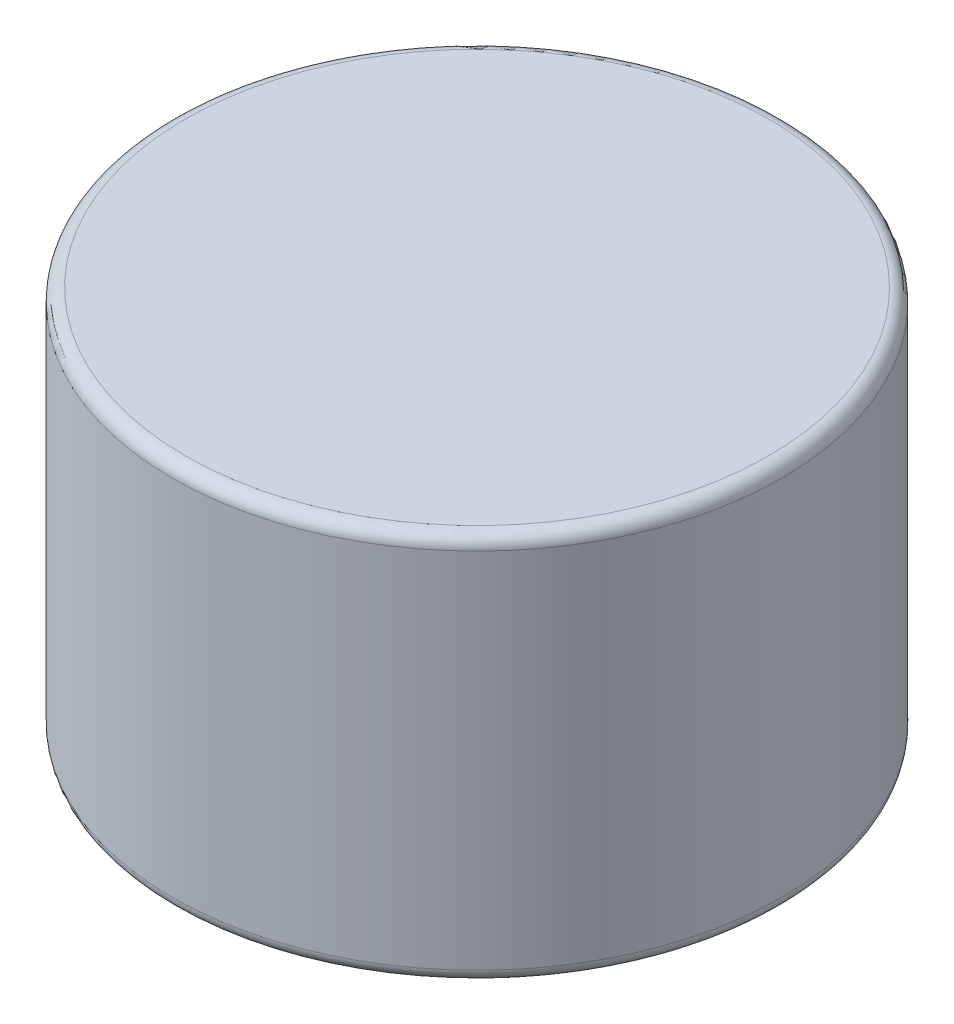
ISO-10303-21;
HEADER;
FILE_DESCRIPTION(('STEP AP214'),'2;1');
FILE_NAME('part.step','',(''),(''),'','','');
FILE_SCHEMA(('AUTOMOTIVE_DESIGN { 1 0 10303 214 1 1 1 1 }'));
ENDSEC;
DATA;
#1=APPLICATION_CONTEXT('core data for automotive mechanical design processes');
#2=APPLICATION_PROTOCOL_DEFINITION('international standard','automotive_design',2000,#1);
#3=PRODUCT_CONTEXT('',#1,'mechanical');
#4=PRODUCT('Part','Part','',(#3));
#5=PRODUCT_RELATED_PRODUCT_CATEGORY('part','',(#4));
#6=PRODUCT_DEFINITION_FORMATION('','',#4);
#7=PRODUCT_DEFINITION_CONTEXT('part definition',#1,'design');
#8=PRODUCT_DEFINITION('design','',#6,#7);
#9=PRODUCT_DEFINITION_SHAPE('','',#8);
#10=(LENGTH_UNIT() NAMED_UNIT(*) SI_UNIT(.MILLI.,.METRE.));
#11=(NAMED_UNIT(*) PLANE_ANGLE_UNIT() SI_UNIT($,.RADIAN.));
#12=(NAMED_UNIT(*) SI_UNIT($,.STERADIAN.) SOLID_ANGLE_UNIT());
#13=UNCERTAINTY_MEASURE_WITH_UNIT(LENGTH_MEASURE(1.E-05),#10,'distance_accuracy_value','');
#14=(GEOMETRIC_REPRESENTATION_CONTEXT(3) GLOBAL_UNCERTAINTY_ASSIGNED_CONTEXT((#13)) GLOBAL_UNIT_ASSIGNED_CONTEXT((#10,
#11,#12)) REPRESENTATION_CONTEXT('',''));
#15=CARTESIAN_POINT('',(0.,0.,0.));
#16=DIRECTION('',(0.,0.,1.));
#17=DIRECTION('',(1.,0.,0.));
#18=AXIS2_PLACEMENT_3D('',#15,#16,#17);
#19=CARTESIAN_POINT('',(-38.1488967769155,3.,24.5976162867038));
#20=DIRECTION('',(0.,-1.,0.));
#21=DIRECTION('',(0.,0.,-1.));
#22=AXIS2_PLACEMENT_3D('',#19,#20,#21);
#23=CYLINDRICAL_SURFACE('',#22,2.35);
#24=CARTESIAN_POINT('',(-38.1488967769155,0.0999999999999998,24.5976162867038));
#25=DIRECTION('',(0.,1.,0.));
#26=DIRECTION('',(0.,0.,1.));
#27=AXIS2_PLACEMENT_3D('',#24,#25,#26);
#28=CIRCLE('',#27,2.35);
#29=CARTESIAN_POINT('',(-38.1488967769155,0.0999999999999998,26.9476162867038));
#30=VERTEX_POINT('',#29);
#31=EDGE_CURVE('E42',#30,#30,#28,.T.);
#32=ORIENTED_EDGE('',*,*,#31,.T.);
#33=EDGE_LOOP('',(#32));
#34=FACE_BOUND('',#33,.T.);
#35=CARTESIAN_POINT('',(-38.1488967769155,2.9,24.5976162867038));
#36=DIRECTION('',(0.,1.,0.));
#37=DIRECTION('',(0.,0.,1.));
#38=AXIS2_PLACEMENT_3D('',#35,#36,#37);
#39=CIRCLE('',#38,2.35);
#40=CARTESIAN_POINT('',(-38.1488967769155,2.9,26.9476162867038));
#41=VERTEX_POINT('',#40);
#42=EDGE_CURVE('E46',#41,#41,#39,.F.);
#43=ORIENTED_EDGE('',*,*,#42,.T.);
#44=EDGE_LOOP('',(#43));
#45=FACE_BOUND('',#44,.T.);
#46=ADVANCED_FACE('F31',(#34,#45),#23,.T.);
#47=CARTESIAN_POINT('',(-38.1488967769155,3.,24.5976162867038));
#48=DIRECTION('',(0.,1.,0.));
#49=DIRECTION('',(0.,0.,1.));
#50=AXIS2_PLACEMENT_3D('',#47,#48,#49);
#51=PLANE('',#50);
#52=CARTESIAN_POINT('',(-38.1488967769155,3.,24.5976162867038));
#53=DIRECTION('',(0.,1.,0.));
#54=DIRECTION('',(0.,0.,1.));
#55=AXIS2_PLACEMENT_3D('',#52,#53,#54);
#56=CIRCLE('',#55,2.25);
#57=CARTESIAN_POINT('',(-38.1488967769155,3.,26.8476162867038));
#58=VERTEX_POINT('',#57);
#59=EDGE_CURVE('E10',#58,#58,#56,.T.);
#60=ORIENTED_EDGE('',*,*,#59,.T.);
#61=EDGE_LOOP('',(#60));
#62=FACE_BOUND('',#61,.T.);
#63=ADVANCED_FACE('F62',(#62),#51,.T.);
#64=CARTESIAN_POINT('',(-38.1488967769155,0.,24.5976162867038));
#65=DIRECTION('',(0.,1.,0.));
#66=DIRECTION('',(0.,0.,1.));
#67=AXIS2_PLACEMENT_3D('',#64,#65,#66);
#68=PLANE('',#67);
#69=CARTESIAN_POINT('',(-38.1488967769155,0.,24.5976162867038));
#70=DIRECTION('',(0.,1.,0.));
#71=DIRECTION('',(0.,0.,1.));
#72=AXIS2_PLACEMENT_3D('',#69,#70,#71);
#73=CIRCLE('',#72,2.25);
#74=CARTESIAN_POINT('',(-38.1488967769155,0.,26.8476162867038));
#75=VERTEX_POINT('',#74);
#76=EDGE_CURVE('E38',#75,#75,#73,.F.);
#77=ORIENTED_EDGE('',*,*,#76,.T.);
#78=EDGE_LOOP('',(#77));
#79=FACE_BOUND('',#78,.T.);
#80=ADVANCED_FACE('F59',(#79),#68,.F.);
#81=CARTESIAN_POINT('',(-38.1488967769155,0.0999999999999998,24.5976162867038));
#82=DIRECTION('',(0.,1.,0.));
#83=DIRECTION('',(0.,0.,1.));
#84=AXIS2_PLACEMENT_3D('',#81,#82,#83);
#85=TOROIDAL_SURFACE('',#84,2.25,0.1);
#86=ORIENTED_EDGE('',*,*,#76,.F.);
#87=EDGE_LOOP('',(#86));
#88=FACE_BOUND('',#87,.T.);
#89=ORIENTED_EDGE('',*,*,#31,.F.);
#90=EDGE_LOOP('',(#89));
#91=FACE_BOUND('',#90,.T.);
#92=ADVANCED_FACE('F55',(#88,#91),#85,.T.);
#93=CARTESIAN_POINT('',(-38.1488967769155,2.9,24.5976162867038));
#94=DIRECTION('',(0.,1.,0.));
#95=DIRECTION('',(0.,0.,1.));
#96=AXIS2_PLACEMENT_3D('',#93,#94,#95);
#97=TOROIDAL_SURFACE('',#96,2.25,0.1);
#98=ORIENTED_EDGE('',*,*,#42,.F.);
#99=EDGE_LOOP('',(#98));
#100=FACE_BOUND('',#99,.T.);
#101=ORIENTED_EDGE('',*,*,#59,.F.);
#102=EDGE_LOOP('',(#101));
#103=FACE_BOUND('',#102,.T.);
#104=ADVANCED_FACE('F33',(#100,#103),#97,.T.);
#105=CLOSED_SHELL('',(#46,#63,#80,#92,#104));
#106=MANIFOLD_SOLID_BREP('B2',#105);
#107=ADVANCED_BREP_SHAPE_REPRESENTATION('',(#18,#106),#14);
#108=SHAPE_DEFINITION_REPRESENTATION(#9,#107);
ENDSEC;
END-ISO-10303-21;
